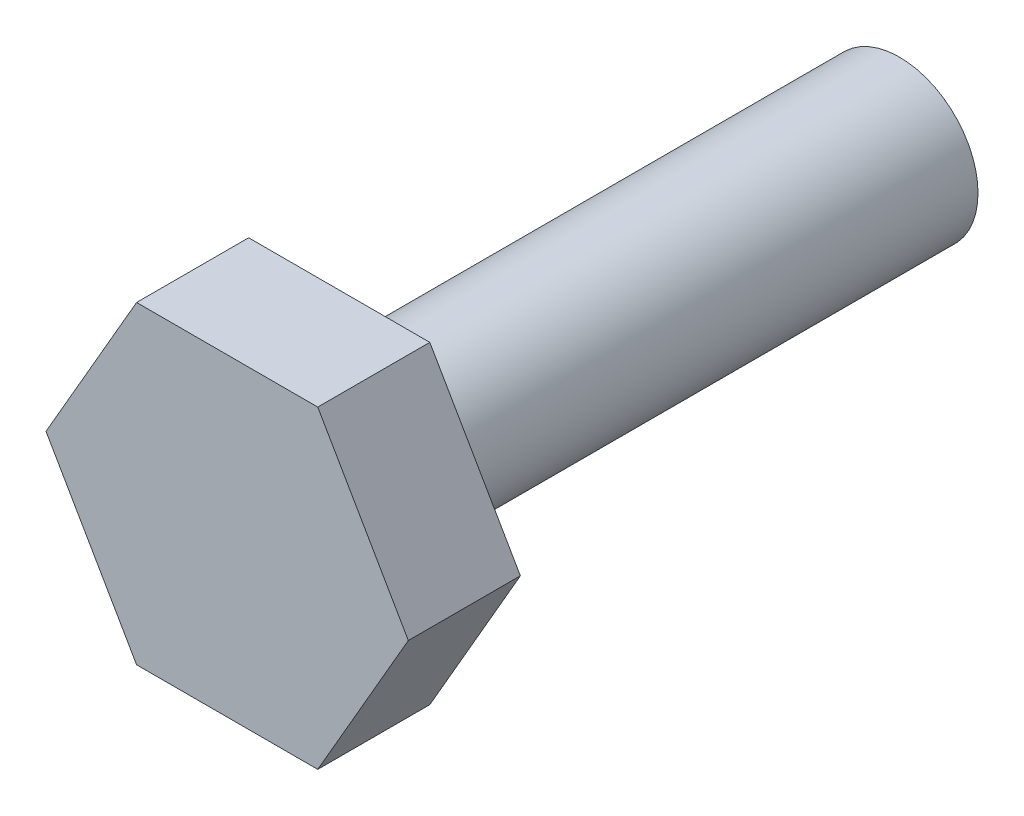
ISO-10303-21;
HEADER;
FILE_DESCRIPTION(('STEP AP214'),'2;1');
FILE_NAME('part.step','',(''),(''),'','','');
FILE_SCHEMA(('AUTOMOTIVE_DESIGN { 1 0 10303 214 1 1 1 1 }'));
ENDSEC;
DATA;
#1=APPLICATION_CONTEXT('core data for automotive mechanical design processes');
#2=APPLICATION_PROTOCOL_DEFINITION('international standard','automotive_design',2000,#1);
#3=PRODUCT_CONTEXT('',#1,'mechanical');
#4=PRODUCT('Part','Part','',(#3));
#5=PRODUCT_RELATED_PRODUCT_CATEGORY('part','',(#4));
#6=PRODUCT_DEFINITION_FORMATION('','',#4);
#7=PRODUCT_DEFINITION_CONTEXT('part definition',#1,'design');
#8=PRODUCT_DEFINITION('design','',#6,#7);
#9=PRODUCT_DEFINITION_SHAPE('','',#8);
#10=(LENGTH_UNIT() NAMED_UNIT(*) SI_UNIT(.MILLI.,.METRE.));
#11=(NAMED_UNIT(*) PLANE_ANGLE_UNIT() SI_UNIT($,.RADIAN.));
#12=(NAMED_UNIT(*) SI_UNIT($,.STERADIAN.) SOLID_ANGLE_UNIT());
#13=UNCERTAINTY_MEASURE_WITH_UNIT(LENGTH_MEASURE(1.E-05),#10,'distance_accuracy_value','');
#14=(GEOMETRIC_REPRESENTATION_CONTEXT(3) GLOBAL_UNCERTAINTY_ASSIGNED_CONTEXT((#13)) GLOBAL_UNIT_ASSIGNED_CONTEXT((#10,
#11,#12)) REPRESENTATION_CONTEXT('',''));
#15=CARTESIAN_POINT('',(0.,0.,0.));
#16=DIRECTION('',(0.,0.,1.));
#17=DIRECTION('',(1.,0.,0.));
#18=AXIS2_PLACEMENT_3D('',#15,#16,#17);
#19=CARTESIAN_POINT('',(2.02072594216369,-3.5,2.5));
#20=DIRECTION('',(-0.866025403784439,0.5,0.));
#21=DIRECTION('',(-0.5,-0.866025403784439,0.));
#22=AXIS2_PLACEMENT_3D('',#19,#20,#21);
#23=PLANE('',#22);
#24=DIRECTION('',(0.5,0.866025403784439,0.));
#25=VECTOR('',#24,1.);
#26=CARTESIAN_POINT('',(2.02072594216369,-3.5,0.));
#27=LINE('',#26,#25);
#28=CARTESIAN_POINT('',(2.02072594216369,-3.5,0.));
#29=VERTEX_POINT('',#28);
#30=CARTESIAN_POINT('',(4.04145188432738,0.,0.));
#31=VERTEX_POINT('',#30);
#32=EDGE_CURVE('E123',#29,#31,#27,.T.);
#33=ORIENTED_EDGE('',*,*,#32,.T.);
#34=DIRECTION('',(0.,0.,-1.));
#35=VECTOR('',#34,1.);
#36=CARTESIAN_POINT('',(4.04145188432738,0.,2.5));
#37=LINE('',#36,#35);
#38=CARTESIAN_POINT('',(4.04145188432738,0.,2.5));
#39=VERTEX_POINT('',#38);
#40=EDGE_CURVE('E11',#39,#31,#37,.T.);
#41=ORIENTED_EDGE('',*,*,#40,.F.);
#42=DIRECTION('',(0.5,0.866025403784439,0.));
#43=VECTOR('',#42,1.);
#44=CARTESIAN_POINT('',(2.02072594216369,-3.5,2.5));
#45=LINE('',#44,#43);
#46=CARTESIAN_POINT('',(2.02072594216369,-3.5,2.5));
#47=VERTEX_POINT('',#46);
#48=EDGE_CURVE('E133',#47,#39,#45,.T.);
#49=ORIENTED_EDGE('',*,*,#48,.F.);
#50=DIRECTION('',(0.,0.,-1.));
#51=VECTOR('',#50,1.);
#52=CARTESIAN_POINT('',(2.02072594216369,-3.5,2.5));
#53=LINE('',#52,#51);
#54=EDGE_CURVE('E118',#47,#29,#53,.T.);
#55=ORIENTED_EDGE('',*,*,#54,.T.);
#56=EDGE_LOOP('',(#33,#41,#49,#55));
#57=FACE_BOUND('',#56,.T.);
#58=ADVANCED_FACE('F39',(#57),#23,.F.);
#59=CARTESIAN_POINT('',(4.04145188432738,0.,2.5));
#60=DIRECTION('',(-0.866025403784439,-0.5,0.));
#61=DIRECTION('',(0.5,-0.866025403784439,0.));
#62=AXIS2_PLACEMENT_3D('',#59,#60,#61);
#63=PLANE('',#62);
#64=DIRECTION('',(-0.5,0.866025403784439,0.));
#65=VECTOR('',#64,1.);
#66=CARTESIAN_POINT('',(4.04145188432738,0.,0.));
#67=LINE('',#66,#65);
#68=CARTESIAN_POINT('',(2.02072594216369,3.5,0.));
#69=VERTEX_POINT('',#68);
#70=EDGE_CURVE('E127',#31,#69,#67,.T.);
#71=ORIENTED_EDGE('',*,*,#70,.T.);
#72=DIRECTION('',(0.,0.,-1.));
#73=VECTOR('',#72,1.);
#74=CARTESIAN_POINT('',(2.02072594216369,3.5,2.5));
#75=LINE('',#74,#73);
#76=CARTESIAN_POINT('',(2.02072594216369,3.5,2.5));
#77=VERTEX_POINT('',#76);
#78=EDGE_CURVE('E50',#77,#69,#75,.T.);
#79=ORIENTED_EDGE('',*,*,#78,.F.);
#80=DIRECTION('',(-0.5,0.866025403784439,0.));
#81=VECTOR('',#80,1.);
#82=CARTESIAN_POINT('',(4.04145188432738,0.,2.5));
#83=LINE('',#82,#81);
#84=EDGE_CURVE('E95',#39,#77,#83,.T.);
#85=ORIENTED_EDGE('',*,*,#84,.F.);
#86=ORIENTED_EDGE('',*,*,#40,.T.);
#87=EDGE_LOOP('',(#71,#79,#85,#86));
#88=FACE_BOUND('',#87,.T.);
#89=ADVANCED_FACE('F158',(#88),#63,.F.);
#90=CARTESIAN_POINT('',(2.02072594216369,3.5,2.5));
#91=DIRECTION('',(0.,-1.,0.));
#92=DIRECTION('',(0.,0.,-1.));
#93=AXIS2_PLACEMENT_3D('',#90,#91,#92);
#94=PLANE('',#93);
#95=DIRECTION('',(-1.,0.,0.));
#96=VECTOR('',#95,1.);
#97=CARTESIAN_POINT('',(2.02072594216369,3.5,0.));
#98=LINE('',#97,#96);
#99=CARTESIAN_POINT('',(-2.02072594216369,3.5,0.));
#100=VERTEX_POINT('',#99);
#101=EDGE_CURVE('E129',#69,#100,#98,.T.);
#102=ORIENTED_EDGE('',*,*,#101,.T.);
#103=DIRECTION('',(0.,0.,-1.));
#104=VECTOR('',#103,1.);
#105=CARTESIAN_POINT('',(-2.02072594216369,3.5,2.5));
#106=LINE('',#105,#104);
#107=CARTESIAN_POINT('',(-2.02072594216369,3.5,2.5));
#108=VERTEX_POINT('',#107);
#109=EDGE_CURVE('E111',#108,#100,#106,.T.);
#110=ORIENTED_EDGE('',*,*,#109,.F.);
#111=DIRECTION('',(-1.,0.,0.));
#112=VECTOR('',#111,1.);
#113=CARTESIAN_POINT('',(2.02072594216369,3.5,2.5));
#114=LINE('',#113,#112);
#115=EDGE_CURVE('E104',#77,#108,#114,.T.);
#116=ORIENTED_EDGE('',*,*,#115,.F.);
#117=ORIENTED_EDGE('',*,*,#78,.T.);
#118=EDGE_LOOP('',(#102,#110,#116,#117));
#119=FACE_BOUND('',#118,.T.);
#120=ADVANCED_FACE('F139',(#119),#94,.F.);
#121=CARTESIAN_POINT('',(-2.02072594216369,3.5,2.5));
#122=DIRECTION('',(0.866025403784439,-0.5,0.));
#123=DIRECTION('',(0.5,0.866025403784439,0.));
#124=AXIS2_PLACEMENT_3D('',#121,#122,#123);
#125=PLANE('',#124);
#126=DIRECTION('',(-0.5,-0.866025403784439,0.));
#127=VECTOR('',#126,1.);
#128=CARTESIAN_POINT('',(-2.02072594216369,3.5,0.));
#129=LINE('',#128,#127);
#130=CARTESIAN_POINT('',(-4.04145188432738,0.,0.));
#131=VERTEX_POINT('',#130);
#132=EDGE_CURVE('E114',#100,#131,#129,.T.);
#133=ORIENTED_EDGE('',*,*,#132,.T.);
#134=DIRECTION('',(0.,0.,-1.));
#135=VECTOR('',#134,1.);
#136=CARTESIAN_POINT('',(-4.04145188432738,0.,2.5));
#137=LINE('',#136,#135);
#138=CARTESIAN_POINT('',(-4.04145188432738,0.,2.5));
#139=VERTEX_POINT('',#138);
#140=EDGE_CURVE('E109',#139,#131,#137,.T.);
#141=ORIENTED_EDGE('',*,*,#140,.F.);
#142=DIRECTION('',(-0.5,-0.866025403784439,0.));
#143=VECTOR('',#142,1.);
#144=CARTESIAN_POINT('',(-2.02072594216369,3.5,2.5));
#145=LINE('',#144,#143);
#146=EDGE_CURVE('E97',#108,#139,#145,.T.);
#147=ORIENTED_EDGE('',*,*,#146,.F.);
#148=ORIENTED_EDGE('',*,*,#109,.T.);
#149=EDGE_LOOP('',(#133,#141,#147,#148));
#150=FACE_BOUND('',#149,.T.);
#151=ADVANCED_FACE('F112',(#150),#125,.F.);
#152=CARTESIAN_POINT('',(-4.04145188432738,0.,2.5));
#153=DIRECTION('',(0.866025403784439,0.5,0.));
#154=DIRECTION('',(-0.5,0.866025403784439,0.));
#155=AXIS2_PLACEMENT_3D('',#152,#153,#154);
#156=PLANE('',#155);
#157=DIRECTION('',(0.5,-0.866025403784439,0.));
#158=VECTOR('',#157,1.);
#159=CARTESIAN_POINT('',(-4.04145188432738,0.,0.));
#160=LINE('',#159,#158);
#161=CARTESIAN_POINT('',(-2.02072594216369,-3.5,0.));
#162=VERTEX_POINT('',#161);
#163=EDGE_CURVE('E77',#131,#162,#160,.T.);
#164=ORIENTED_EDGE('',*,*,#163,.T.);
#165=DIRECTION('',(0.,0.,-1.));
#166=VECTOR('',#165,1.);
#167=CARTESIAN_POINT('',(-2.02072594216369,-3.5,2.5));
#168=LINE('',#167,#166);
#169=CARTESIAN_POINT('',(-2.02072594216369,-3.5,2.5));
#170=VERTEX_POINT('',#169);
#171=EDGE_CURVE('E113',#170,#162,#168,.T.);
#172=ORIENTED_EDGE('',*,*,#171,.F.);
#173=DIRECTION('',(0.5,-0.866025403784439,0.));
#174=VECTOR('',#173,1.);
#175=CARTESIAN_POINT('',(-4.04145188432738,0.,2.5));
#176=LINE('',#175,#174);
#177=EDGE_CURVE('E103',#139,#170,#176,.T.);
#178=ORIENTED_EDGE('',*,*,#177,.F.);
#179=ORIENTED_EDGE('',*,*,#140,.T.);
#180=EDGE_LOOP('',(#164,#172,#178,#179));
#181=FACE_BOUND('',#180,.T.);
#182=ADVANCED_FACE('F120',(#181),#156,.F.);
#183=CARTESIAN_POINT('',(-2.02072594216369,-3.5,2.5));
#184=DIRECTION('',(0.,1.,0.));
#185=DIRECTION('',(0.,0.,1.));
#186=AXIS2_PLACEMENT_3D('',#183,#184,#185);
#187=PLANE('',#186);
#188=DIRECTION('',(1.,0.,0.));
#189=VECTOR('',#188,1.);
#190=CARTESIAN_POINT('',(-2.02072594216369,-3.5,0.));
#191=LINE('',#190,#189);
#192=EDGE_CURVE('E82',#162,#29,#191,.T.);
#193=ORIENTED_EDGE('',*,*,#192,.T.);
#194=ORIENTED_EDGE('',*,*,#54,.F.);
#195=DIRECTION('',(1.,0.,0.));
#196=VECTOR('',#195,1.);
#197=CARTESIAN_POINT('',(-2.02072594216369,-3.5,2.5));
#198=LINE('',#197,#196);
#199=EDGE_CURVE('E54',#170,#47,#198,.T.);
#200=ORIENTED_EDGE('',*,*,#199,.F.);
#201=ORIENTED_EDGE('',*,*,#171,.T.);
#202=EDGE_LOOP('',(#193,#194,#200,#201));
#203=FACE_BOUND('',#202,.T.);
#204=ADVANCED_FACE('F150',(#203),#187,.F.);
#205=CARTESIAN_POINT('',(0.,0.,2.5));
#206=DIRECTION('',(0.,0.,1.));
#207=DIRECTION('',(1.,0.,0.));
#208=AXIS2_PLACEMENT_3D('',#205,#206,#207);
#209=PLANE('',#208);
#210=ORIENTED_EDGE('',*,*,#48,.T.);
#211=ORIENTED_EDGE('',*,*,#84,.T.);
#212=ORIENTED_EDGE('',*,*,#115,.T.);
#213=ORIENTED_EDGE('',*,*,#146,.T.);
#214=ORIENTED_EDGE('',*,*,#177,.T.);
#215=ORIENTED_EDGE('',*,*,#199,.T.);
#216=EDGE_LOOP('',(#210,#211,#212,#213,#214,#215));
#217=FACE_BOUND('',#216,.T.);
#218=ADVANCED_FACE('F101',(#217),#209,.T.);
#219=CARTESIAN_POINT('',(0.,0.,0.));
#220=DIRECTION('',(0.,0.,1.));
#221=DIRECTION('',(1.,0.,0.));
#222=AXIS2_PLACEMENT_3D('',#219,#220,#221);
#223=PLANE('',#222);
#224=CARTESIAN_POINT('',(0.,0.,0.));
#225=DIRECTION('',(0.,0.,1.));
#226=DIRECTION('',(1.,0.,0.));
#227=AXIS2_PLACEMENT_3D('',#224,#225,#226);
#228=CIRCLE('',#227,1.75);
#229=CARTESIAN_POINT('',(1.75,0.,0.));
#230=VERTEX_POINT('',#229);
#231=EDGE_CURVE('E130',#230,#230,#228,.T.);
#232=ORIENTED_EDGE('',*,*,#231,.T.);
#233=EDGE_LOOP('',(#232));
#234=FACE_BOUND('',#233,.T.);
#235=ORIENTED_EDGE('',*,*,#32,.F.);
#236=ORIENTED_EDGE('',*,*,#192,.F.);
#237=ORIENTED_EDGE('',*,*,#163,.F.);
#238=ORIENTED_EDGE('',*,*,#132,.F.);
#239=ORIENTED_EDGE('',*,*,#101,.F.);
#240=ORIENTED_EDGE('',*,*,#70,.F.);
#241=EDGE_LOOP('',(#235,#236,#237,#238,#239,#240));
#242=FACE_BOUND('',#241,.T.);
#243=ADVANCED_FACE('F141',(#234,#242),#223,.F.);
#244=CARTESIAN_POINT('',(0.,0.,0.));
#245=DIRECTION('',(0.,0.,-1.));
#246=DIRECTION('',(-1.,0.,0.));
#247=AXIS2_PLACEMENT_3D('',#244,#245,#246);
#248=CYLINDRICAL_SURFACE('',#247,1.75);
#249=ORIENTED_EDGE('',*,*,#231,.F.);
#250=EDGE_LOOP('',(#249));
#251=FACE_BOUND('',#250,.T.);
#252=CARTESIAN_POINT('',(0.,0.,-12.5));
#253=DIRECTION('',(0.,0.,1.));
#254=DIRECTION('',(1.,0.,0.));
#255=AXIS2_PLACEMENT_3D('',#252,#253,#254);
#256=CIRCLE('',#255,1.75);
#257=CARTESIAN_POINT('',(1.75,0.,-12.5));
#258=VERTEX_POINT('',#257);
#259=EDGE_CURVE('E222',#258,#258,#256,.T.);
#260=ORIENTED_EDGE('',*,*,#259,.T.);
#261=EDGE_LOOP('',(#260));
#262=FACE_BOUND('',#261,.T.);
#263=ADVANCED_FACE('F197',(#251,#262),#248,.T.);
#264=CARTESIAN_POINT('',(0.,0.,-12.5));
#265=DIRECTION('',(0.,0.,1.));
#266=DIRECTION('',(1.,0.,0.));
#267=AXIS2_PLACEMENT_3D('',#264,#265,#266);
#268=PLANE('',#267);
#269=ORIENTED_EDGE('',*,*,#259,.F.);
#270=EDGE_LOOP('',(#269));
#271=FACE_BOUND('',#270,.T.);
#272=ADVANCED_FACE('F206',(#271),#268,.F.);
#273=CLOSED_SHELL('',(#58,#89,#120,#151,#182,#204,#218,#243,#263,#272));
#274=MANIFOLD_SOLID_BREP('B2',#273);
#275=ADVANCED_BREP_SHAPE_REPRESENTATION('',(#18,#274),#14);
#276=SHAPE_DEFINITION_REPRESENTATION(#9,#275);
ENDSEC;
END-ISO-10303-21;
